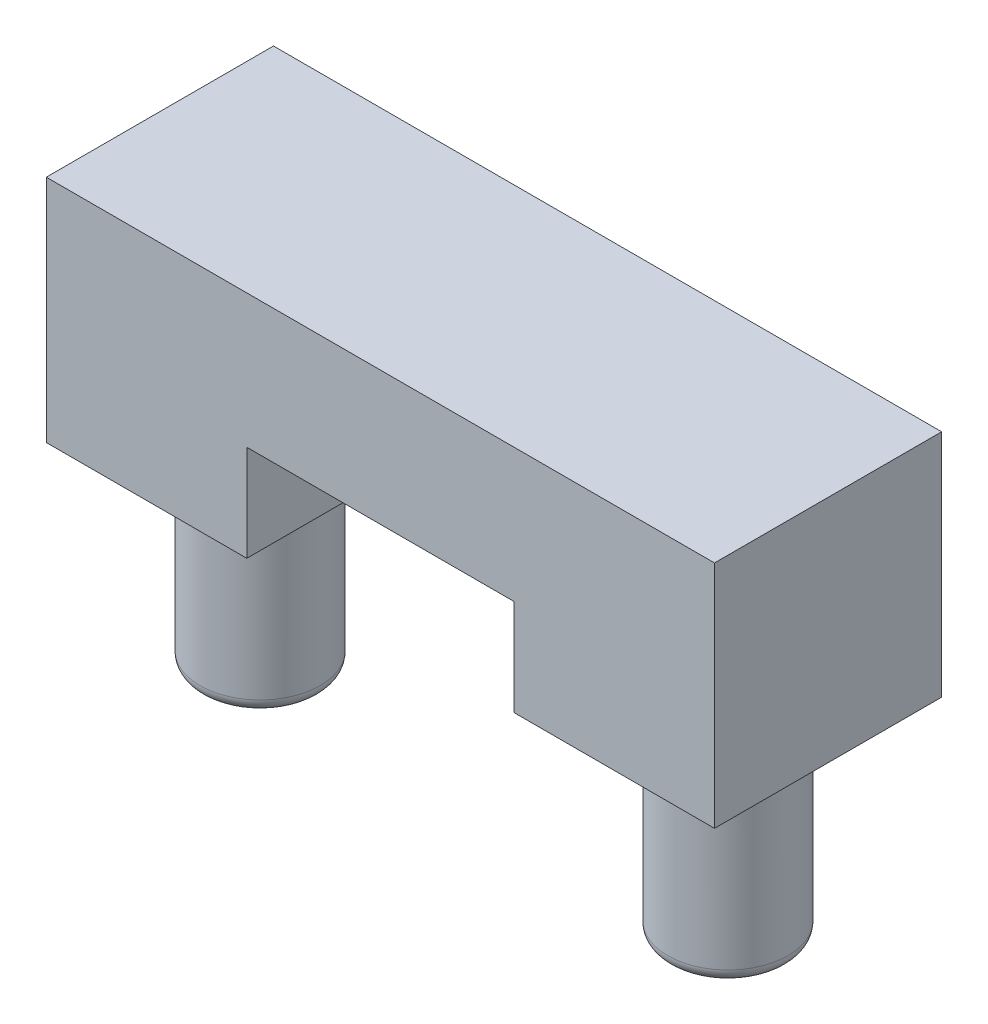
ISO-10303-21;
HEADER;
FILE_DESCRIPTION(('STEP AP214'),'2;1');
FILE_NAME('part.step','',(''),(''),'','','');
FILE_SCHEMA(('AUTOMOTIVE_DESIGN { 1 0 10303 214 1 1 1 1 }'));
ENDSEC;
DATA;
#1=APPLICATION_CONTEXT('core data for automotive mechanical design processes');
#2=APPLICATION_PROTOCOL_DEFINITION('international standard','automotive_design',2000,#1);
#3=PRODUCT_CONTEXT('',#1,'mechanical');
#4=PRODUCT('Part','Part','',(#3));
#5=PRODUCT_RELATED_PRODUCT_CATEGORY('part','',(#4));
#6=PRODUCT_DEFINITION_FORMATION('','',#4);
#7=PRODUCT_DEFINITION_CONTEXT('part definition',#1,'design');
#8=PRODUCT_DEFINITION('design','',#6,#7);
#9=PRODUCT_DEFINITION_SHAPE('','',#8);
#10=(LENGTH_UNIT() NAMED_UNIT(*) SI_UNIT(.MILLI.,.METRE.));
#11=(NAMED_UNIT(*) PLANE_ANGLE_UNIT() SI_UNIT($,.RADIAN.));
#12=(NAMED_UNIT(*) SI_UNIT($,.STERADIAN.) SOLID_ANGLE_UNIT());
#13=UNCERTAINTY_MEASURE_WITH_UNIT(LENGTH_MEASURE(1.E-05),#10,'distance_accuracy_value','');
#14=(GEOMETRIC_REPRESENTATION_CONTEXT(3) GLOBAL_UNCERTAINTY_ASSIGNED_CONTEXT((#13)) GLOBAL_UNIT_ASSIGNED_CONTEXT((#10,
#11,#12)) REPRESENTATION_CONTEXT('',''));
#15=CARTESIAN_POINT('',(0.,0.,0.));
#16=DIRECTION('',(0.,0.,1.));
#17=DIRECTION('',(1.,0.,0.));
#18=AXIS2_PLACEMENT_3D('',#15,#16,#17);
#19=CARTESIAN_POINT('',(0.,0.,0.));
#20=DIRECTION('',(0.,1.,0.));
#21=DIRECTION('',(0.,0.,1.));
#22=AXIS2_PLACEMENT_3D('',#19,#20,#21);
#23=PLANE('',#22);
#24=DIRECTION('',(0.,0.,-1.));
#25=VECTOR('',#24,1.);
#26=CARTESIAN_POINT('',(10.,0.,8.5));
#27=LINE('',#26,#25);
#28=CARTESIAN_POINT('',(10.,0.,8.5));
#29=VERTEX_POINT('',#28);
#30=CARTESIAN_POINT('',(10.,0.,-8.5));
#31=VERTEX_POINT('',#30);
#32=EDGE_CURVE('E111',#29,#31,#27,.T.);
#33=ORIENTED_EDGE('',*,*,#32,.F.);
#34=DIRECTION('',(1.,0.,0.));
#35=VECTOR('',#34,1.);
#36=CARTESIAN_POINT('',(-25.,0.,8.5));
#37=LINE('',#36,#35);
#38=CARTESIAN_POINT('',(-10.,0.,8.5));
#39=VERTEX_POINT('',#38);
#40=EDGE_CURVE('E129',#39,#29,#37,.T.);
#41=ORIENTED_EDGE('',*,*,#40,.F.);
#42=DIRECTION('',(0.,0.,1.));
#43=VECTOR('',#42,1.);
#44=CARTESIAN_POINT('',(-10.,0.,-8.5));
#45=LINE('',#44,#43);
#46=CARTESIAN_POINT('',(-10.,0.,-8.5));
#47=VERTEX_POINT('',#46);
#48=EDGE_CURVE('E120',#47,#39,#45,.T.);
#49=ORIENTED_EDGE('',*,*,#48,.F.);
#50=DIRECTION('',(-1.,0.,0.));
#51=VECTOR('',#50,1.);
#52=CARTESIAN_POINT('',(-25.,0.,-8.5));
#53=LINE('',#52,#51);
#54=EDGE_CURVE('E58',#31,#47,#53,.T.);
#55=ORIENTED_EDGE('',*,*,#54,.F.);
#56=EDGE_LOOP('',(#33,#41,#49,#55));
#57=FACE_BOUND('',#56,.T.);
#58=ADVANCED_FACE('F43',(#57),#23,.F.);
#59=CARTESIAN_POINT('',(25.,10.,-8.5));
#60=DIRECTION('',(-1.,0.,0.));
#61=DIRECTION('',(0.,0.,1.));
#62=AXIS2_PLACEMENT_3D('',#59,#60,#61);
#63=PLANE('',#62);
#64=DIRECTION('',(0.,-1.,0.));
#65=VECTOR('',#64,1.);
#66=CARTESIAN_POINT('',(25.,10.,8.5));
#67=LINE('',#66,#65);
#68=CARTESIAN_POINT('',(25.,10.,8.5));
#69=VERTEX_POINT('',#68);
#70=CARTESIAN_POINT('',(25.,-7.2,8.5));
#71=VERTEX_POINT('',#70);
#72=EDGE_CURVE('E139',#69,#71,#67,.T.);
#73=ORIENTED_EDGE('',*,*,#72,.T.);
#74=DIRECTION('',(0.,0.,1.));
#75=VECTOR('',#74,1.);
#76=CARTESIAN_POINT('',(25.,-7.2,8.5));
#77=LINE('',#76,#75);
#78=CARTESIAN_POINT('',(25.,-7.2,-8.5));
#79=VERTEX_POINT('',#78);
#80=EDGE_CURVE('E121',#79,#71,#77,.T.);
#81=ORIENTED_EDGE('',*,*,#80,.F.);
#82=DIRECTION('',(0.,-1.,0.));
#83=VECTOR('',#82,1.);
#84=CARTESIAN_POINT('',(25.,10.,-8.5));
#85=LINE('',#84,#83);
#86=CARTESIAN_POINT('',(25.,10.,-8.5));
#87=VERTEX_POINT('',#86);
#88=EDGE_CURVE('E145',#87,#79,#85,.T.);
#89=ORIENTED_EDGE('',*,*,#88,.F.);
#90=DIRECTION('',(0.,0.,-1.));
#91=VECTOR('',#90,1.);
#92=CARTESIAN_POINT('',(25.,10.,-8.5));
#93=LINE('',#92,#91);
#94=EDGE_CURVE('E132',#69,#87,#93,.T.);
#95=ORIENTED_EDGE('',*,*,#94,.F.);
#96=EDGE_LOOP('',(#73,#81,#89,#95));
#97=FACE_BOUND('',#96,.T.);
#98=ADVANCED_FACE('F173',(#97),#63,.F.);
#99=CARTESIAN_POINT('',(-25.,10.,-8.5));
#100=DIRECTION('',(0.,0.,1.));
#101=DIRECTION('',(1.,0.,0.));
#102=AXIS2_PLACEMENT_3D('',#99,#100,#101);
#103=PLANE('',#102);
#104=ORIENTED_EDGE('',*,*,#88,.T.);
#105=DIRECTION('',(1.,0.,0.));
#106=VECTOR('',#105,1.);
#107=CARTESIAN_POINT('',(25.,-7.2,-8.5));
#108=LINE('',#107,#106);
#109=CARTESIAN_POINT('',(10.,-7.2,-8.5));
#110=VERTEX_POINT('',#109);
#111=EDGE_CURVE('E125',#110,#79,#108,.T.);
#112=ORIENTED_EDGE('',*,*,#111,.F.);
#113=DIRECTION('',(0.,1.,0.));
#114=VECTOR('',#113,1.);
#115=CARTESIAN_POINT('',(10.,-7.2,-8.5));
#116=LINE('',#115,#114);
#117=EDGE_CURVE('E114',#110,#31,#116,.T.);
#118=ORIENTED_EDGE('',*,*,#117,.T.);
#119=ORIENTED_EDGE('',*,*,#54,.T.);
#120=DIRECTION('',(0.,1.,0.));
#121=VECTOR('',#120,1.);
#122=CARTESIAN_POINT('',(-10.,-7.2,-8.5));
#123=LINE('',#122,#121);
#124=CARTESIAN_POINT('',(-10.,-7.2,-8.5));
#125=VERTEX_POINT('',#124);
#126=EDGE_CURVE('E130',#125,#47,#123,.T.);
#127=ORIENTED_EDGE('',*,*,#126,.F.);
#128=DIRECTION('',(1.,0.,0.));
#129=VECTOR('',#128,1.);
#130=CARTESIAN_POINT('',(-25.,-7.2,-8.5));
#131=LINE('',#130,#129);
#132=CARTESIAN_POINT('',(-25.,-7.2,-8.5));
#133=VERTEX_POINT('',#132);
#134=EDGE_CURVE('E348',#133,#125,#131,.T.);
#135=ORIENTED_EDGE('',*,*,#134,.F.);
#136=DIRECTION('',(0.,-1.,0.));
#137=VECTOR('',#136,1.);
#138=CARTESIAN_POINT('',(-25.,10.,-8.5));
#139=LINE('',#138,#137);
#140=CARTESIAN_POINT('',(-25.,10.,-8.5));
#141=VERTEX_POINT('',#140);
#142=EDGE_CURVE('E143',#141,#133,#139,.T.);
#143=ORIENTED_EDGE('',*,*,#142,.F.);
#144=DIRECTION('',(-1.,0.,0.));
#145=VECTOR('',#144,1.);
#146=CARTESIAN_POINT('',(-25.,10.,-8.5));
#147=LINE('',#146,#145);
#148=EDGE_CURVE('E332',#87,#141,#147,.T.);
#149=ORIENTED_EDGE('',*,*,#148,.F.);
#150=EDGE_LOOP('',(#104,#112,#118,#119,#127,#135,#143,#149));
#151=FACE_BOUND('',#150,.T.);
#152=ADVANCED_FACE('F123',(#151),#103,.F.);
#153=CARTESIAN_POINT('',(-25.,10.,-8.5));
#154=DIRECTION('',(1.,0.,0.));
#155=DIRECTION('',(0.,0.,-1.));
#156=AXIS2_PLACEMENT_3D('',#153,#154,#155);
#157=PLANE('',#156);
#158=ORIENTED_EDGE('',*,*,#142,.T.);
#159=DIRECTION('',(0.,0.,-1.));
#160=VECTOR('',#159,1.);
#161=CARTESIAN_POINT('',(-25.,-7.2,-8.5));
#162=LINE('',#161,#160);
#163=CARTESIAN_POINT('',(-25.,-7.2,8.5));
#164=VERTEX_POINT('',#163);
#165=EDGE_CURVE('E345',#164,#133,#162,.T.);
#166=ORIENTED_EDGE('',*,*,#165,.F.);
#167=DIRECTION('',(0.,-1.,0.));
#168=VECTOR('',#167,1.);
#169=CARTESIAN_POINT('',(-25.,10.,8.5));
#170=LINE('',#169,#168);
#171=CARTESIAN_POINT('',(-25.,10.,8.5));
#172=VERTEX_POINT('',#171);
#173=EDGE_CURVE('E141',#172,#164,#170,.T.);
#174=ORIENTED_EDGE('',*,*,#173,.F.);
#175=DIRECTION('',(0.,0.,1.));
#176=VECTOR('',#175,1.);
#177=CARTESIAN_POINT('',(-25.,10.,-8.5));
#178=LINE('',#177,#176);
#179=EDGE_CURVE('E358',#141,#172,#178,.T.);
#180=ORIENTED_EDGE('',*,*,#179,.F.);
#181=EDGE_LOOP('',(#158,#166,#174,#180));
#182=FACE_BOUND('',#181,.T.);
#183=ADVANCED_FACE('F188',(#182),#157,.F.);
#184=CARTESIAN_POINT('',(-25.,10.,8.5));
#185=DIRECTION('',(0.,0.,-1.));
#186=DIRECTION('',(-1.,0.,0.));
#187=AXIS2_PLACEMENT_3D('',#184,#185,#186);
#188=PLANE('',#187);
#189=ORIENTED_EDGE('',*,*,#173,.T.);
#190=DIRECTION('',(-1.,0.,0.));
#191=VECTOR('',#190,1.);
#192=CARTESIAN_POINT('',(-25.,-7.2,8.5));
#193=LINE('',#192,#191);
#194=CARTESIAN_POINT('',(-10.,-7.2,8.5));
#195=VERTEX_POINT('',#194);
#196=EDGE_CURVE('E352',#195,#164,#193,.T.);
#197=ORIENTED_EDGE('',*,*,#196,.F.);
#198=DIRECTION('',(0.,1.,0.));
#199=VECTOR('',#198,1.);
#200=CARTESIAN_POINT('',(-10.,-7.2,8.5));
#201=LINE('',#200,#199);
#202=EDGE_CURVE('E134',#195,#39,#201,.T.);
#203=ORIENTED_EDGE('',*,*,#202,.T.);
#204=ORIENTED_EDGE('',*,*,#40,.T.);
#205=DIRECTION('',(0.,1.,0.));
#206=VECTOR('',#205,1.);
#207=CARTESIAN_POINT('',(10.,-7.2,8.5));
#208=LINE('',#207,#206);
#209=CARTESIAN_POINT('',(10.,-7.2,8.5));
#210=VERTEX_POINT('',#209);
#211=EDGE_CURVE('E117',#210,#29,#208,.T.);
#212=ORIENTED_EDGE('',*,*,#211,.F.);
#213=DIRECTION('',(-1.,0.,0.));
#214=VECTOR('',#213,1.);
#215=CARTESIAN_POINT('',(25.,-7.2,8.5));
#216=LINE('',#215,#214);
#217=EDGE_CURVE('E340',#71,#210,#216,.T.);
#218=ORIENTED_EDGE('',*,*,#217,.F.);
#219=ORIENTED_EDGE('',*,*,#72,.F.);
#220=DIRECTION('',(1.,0.,0.));
#221=VECTOR('',#220,1.);
#222=CARTESIAN_POINT('',(-25.,10.,8.5));
#223=LINE('',#222,#221);
#224=EDGE_CURVE('E66',#172,#69,#223,.T.);
#225=ORIENTED_EDGE('',*,*,#224,.F.);
#226=EDGE_LOOP('',(#189,#197,#203,#204,#212,#218,#219,#225));
#227=FACE_BOUND('',#226,.T.);
#228=ADVANCED_FACE('F185',(#227),#188,.F.);
#229=CARTESIAN_POINT('',(0.,10.,0.));
#230=DIRECTION('',(0.,1.,0.));
#231=DIRECTION('',(0.,0.,1.));
#232=AXIS2_PLACEMENT_3D('',#229,#230,#231);
#233=PLANE('',#232);
#234=ORIENTED_EDGE('',*,*,#94,.T.);
#235=ORIENTED_EDGE('',*,*,#148,.T.);
#236=ORIENTED_EDGE('',*,*,#179,.T.);
#237=ORIENTED_EDGE('',*,*,#224,.T.);
#238=EDGE_LOOP('',(#234,#235,#236,#237));
#239=FACE_BOUND('',#238,.T.);
#240=ADVANCED_FACE('F183',(#239),#233,.T.);
#241=CARTESIAN_POINT('',(-10.,-7.2,-8.5));
#242=DIRECTION('',(-1.,0.,0.));
#243=DIRECTION('',(0.,0.,1.));
#244=AXIS2_PLACEMENT_3D('',#241,#242,#243);
#245=PLANE('',#244);
#246=ORIENTED_EDGE('',*,*,#48,.T.);
#247=ORIENTED_EDGE('',*,*,#202,.F.);
#248=DIRECTION('',(0.,0.,1.));
#249=VECTOR('',#248,1.);
#250=CARTESIAN_POINT('',(-10.,-7.2,-8.5));
#251=LINE('',#250,#249);
#252=EDGE_CURVE('E350',#125,#195,#251,.T.);
#253=ORIENTED_EDGE('',*,*,#252,.F.);
#254=ORIENTED_EDGE('',*,*,#126,.T.);
#255=EDGE_LOOP('',(#246,#247,#253,#254));
#256=FACE_BOUND('',#255,.T.);
#257=ADVANCED_FACE('F213',(#256),#245,.F.);
#258=CARTESIAN_POINT('',(0.,-7.2,0.));
#259=DIRECTION('',(0.,1.,0.));
#260=DIRECTION('',(0.,0.,1.));
#261=AXIS2_PLACEMENT_3D('',#258,#259,#260);
#262=PLANE('',#261);
#263=CARTESIAN_POINT('',(-17.5,-7.2,0.));
#264=DIRECTION('',(0.,1.,0.));
#265=DIRECTION('',(0.,0.,1.));
#266=AXIS2_PLACEMENT_3D('',#263,#264,#265);
#267=CIRCLE('',#266,4.5);
#268=CARTESIAN_POINT('',(-17.5,-7.2,4.5));
#269=VERTEX_POINT('',#268);
#270=EDGE_CURVE('E147',#269,#269,#267,.F.);
#271=ORIENTED_EDGE('',*,*,#270,.F.);
#272=EDGE_LOOP('',(#271));
#273=FACE_BOUND('',#272,.T.);
#274=ORIENTED_EDGE('',*,*,#165,.T.);
#275=ORIENTED_EDGE('',*,*,#134,.T.);
#276=ORIENTED_EDGE('',*,*,#252,.T.);
#277=ORIENTED_EDGE('',*,*,#196,.T.);
#278=EDGE_LOOP('',(#274,#275,#276,#277));
#279=FACE_BOUND('',#278,.T.);
#280=ADVANCED_FACE('F216',(#273,#279),#262,.F.);
#281=CARTESIAN_POINT('',(10.,-7.2,8.5));
#282=DIRECTION('',(1.,0.,0.));
#283=DIRECTION('',(0.,0.,-1.));
#284=AXIS2_PLACEMENT_3D('',#281,#282,#283);
#285=PLANE('',#284);
#286=ORIENTED_EDGE('',*,*,#32,.T.);
#287=ORIENTED_EDGE('',*,*,#117,.F.);
#288=DIRECTION('',(0.,0.,-1.));
#289=VECTOR('',#288,1.);
#290=CARTESIAN_POINT('',(10.,-7.2,8.5));
#291=LINE('',#290,#289);
#292=EDGE_CURVE('E338',#210,#110,#291,.T.);
#293=ORIENTED_EDGE('',*,*,#292,.F.);
#294=ORIENTED_EDGE('',*,*,#211,.T.);
#295=EDGE_LOOP('',(#286,#287,#293,#294));
#296=FACE_BOUND('',#295,.T.);
#297=ADVANCED_FACE('F112',(#296),#285,.F.);
#298=CARTESIAN_POINT('',(0.,-7.2,0.));
#299=DIRECTION('',(0.,1.,0.));
#300=DIRECTION('',(0.,0.,1.));
#301=AXIS2_PLACEMENT_3D('',#298,#299,#300);
#302=PLANE('',#301);
#303=CARTESIAN_POINT('',(17.5,-7.2,0.));
#304=DIRECTION('',(0.,1.,0.));
#305=DIRECTION('',(0.,0.,1.));
#306=AXIS2_PLACEMENT_3D('',#303,#304,#305);
#307=CIRCLE('',#306,4.5);
#308=CARTESIAN_POINT('',(17.5,-7.2,4.5));
#309=VERTEX_POINT('',#308);
#310=EDGE_CURVE('E150',#309,#309,#307,.F.);
#311=ORIENTED_EDGE('',*,*,#310,.F.);
#312=EDGE_LOOP('',(#311));
#313=FACE_BOUND('',#312,.T.);
#314=ORIENTED_EDGE('',*,*,#80,.T.);
#315=ORIENTED_EDGE('',*,*,#217,.T.);
#316=ORIENTED_EDGE('',*,*,#292,.T.);
#317=ORIENTED_EDGE('',*,*,#111,.T.);
#318=EDGE_LOOP('',(#314,#315,#316,#317));
#319=FACE_BOUND('',#318,.T.);
#320=ADVANCED_FACE('F225',(#313,#319),#302,.F.);
#321=CARTESIAN_POINT('',(-17.5,-22.2,0.));
#322=DIRECTION('',(0.,1.,0.));
#323=DIRECTION('',(0.,0.,1.));
#324=AXIS2_PLACEMENT_3D('',#321,#322,#323);
#325=CYLINDRICAL_SURFACE('',#324,4.5);
#326=CARTESIAN_POINT('',(-17.5,-21.2,0.));
#327=DIRECTION('',(0.,-1.,0.));
#328=DIRECTION('',(0.,0.,-1.));
#329=AXIS2_PLACEMENT_3D('',#326,#327,#328);
#330=CIRCLE('',#329,4.5);
#331=CARTESIAN_POINT('',(-17.5,-21.2,-4.5));
#332=VERTEX_POINT('',#331);
#333=EDGE_CURVE('E11',#332,#332,#330,.F.);
#334=ORIENTED_EDGE('',*,*,#333,.T.);
#335=EDGE_LOOP('',(#334));
#336=FACE_BOUND('',#335,.T.);
#337=ORIENTED_EDGE('',*,*,#270,.T.);
#338=EDGE_LOOP('',(#337));
#339=FACE_BOUND('',#338,.T.);
#340=ADVANCED_FACE('F240',(#336,#339),#325,.T.);
#341=CARTESIAN_POINT('',(-17.5,-22.2,0.));
#342=DIRECTION('',(0.,-1.,0.));
#343=DIRECTION('',(0.,0.,-1.));
#344=AXIS2_PLACEMENT_3D('',#341,#342,#343);
#345=PLANE('',#344);
#346=CARTESIAN_POINT('',(-17.5,-22.2,0.));
#347=DIRECTION('',(0.,-1.,0.));
#348=DIRECTION('',(0.,0.,-1.));
#349=AXIS2_PLACEMENT_3D('',#346,#347,#348);
#350=CIRCLE('',#349,3.5);
#351=CARTESIAN_POINT('',(-17.5,-22.2,-3.5));
#352=VERTEX_POINT('',#351);
#353=EDGE_CURVE('E51',#352,#352,#350,.T.);
#354=ORIENTED_EDGE('',*,*,#353,.T.);
#355=EDGE_LOOP('',(#354));
#356=FACE_BOUND('',#355,.T.);
#357=ADVANCED_FACE('F161',(#356),#345,.T.);
#358=CARTESIAN_POINT('',(17.5,-22.2,0.));
#359=DIRECTION('',(0.,1.,0.));
#360=DIRECTION('',(0.,0.,1.));
#361=AXIS2_PLACEMENT_3D('',#358,#359,#360);
#362=CYLINDRICAL_SURFACE('',#361,4.5);
#363=CARTESIAN_POINT('',(17.5,-21.2,0.));
#364=DIRECTION('',(0.,-1.,0.));
#365=DIRECTION('',(0.,0.,-1.));
#366=AXIS2_PLACEMENT_3D('',#363,#364,#365);
#367=CIRCLE('',#366,4.5);
#368=CARTESIAN_POINT('',(17.5,-21.2,-4.5));
#369=VERTEX_POINT('',#368);
#370=EDGE_CURVE('E156',#369,#369,#367,.F.);
#371=ORIENTED_EDGE('',*,*,#370,.T.);
#372=EDGE_LOOP('',(#371));
#373=FACE_BOUND('',#372,.T.);
#374=ORIENTED_EDGE('',*,*,#310,.T.);
#375=EDGE_LOOP('',(#374));
#376=FACE_BOUND('',#375,.T.);
#377=ADVANCED_FACE('F257',(#373,#376),#362,.T.);
#378=CARTESIAN_POINT('',(17.5,-22.2,0.));
#379=DIRECTION('',(0.,-1.,0.));
#380=DIRECTION('',(0.,0.,-1.));
#381=AXIS2_PLACEMENT_3D('',#378,#379,#380);
#382=PLANE('',#381);
#383=CARTESIAN_POINT('',(17.5,-22.2,0.));
#384=DIRECTION('',(0.,-1.,0.));
#385=DIRECTION('',(0.,0.,-1.));
#386=AXIS2_PLACEMENT_3D('',#383,#384,#385);
#387=CIRCLE('',#386,3.5);
#388=CARTESIAN_POINT('',(17.5,-22.2,-3.5));
#389=VERTEX_POINT('',#388);
#390=EDGE_CURVE('E153',#389,#389,#387,.T.);
#391=ORIENTED_EDGE('',*,*,#390,.T.);
#392=EDGE_LOOP('',(#391));
#393=FACE_BOUND('',#392,.T.);
#394=ADVANCED_FACE('F169',(#393),#382,.T.);
#395=CARTESIAN_POINT('',(17.5,-21.2,0.));
#396=DIRECTION('',(0.,-1.,0.));
#397=DIRECTION('',(0.,0.,-1.));
#398=AXIS2_PLACEMENT_3D('',#395,#396,#397);
#399=TOROIDAL_SURFACE('',#398,3.5,1.);
#400=ORIENTED_EDGE('',*,*,#370,.F.);
#401=EDGE_LOOP('',(#400));
#402=FACE_BOUND('',#401,.T.);
#403=ORIENTED_EDGE('',*,*,#390,.F.);
#404=EDGE_LOOP('',(#403));
#405=FACE_BOUND('',#404,.T.);
#406=ADVANCED_FACE('F164',(#402,#405),#399,.T.);
#407=CARTESIAN_POINT('',(-17.5,-21.2,0.));
#408=DIRECTION('',(0.,-1.,0.));
#409=DIRECTION('',(0.,0.,-1.));
#410=AXIS2_PLACEMENT_3D('',#407,#408,#409);
#411=TOROIDAL_SURFACE('',#410,3.5,1.);
#412=ORIENTED_EDGE('',*,*,#333,.F.);
#413=EDGE_LOOP('',(#412));
#414=FACE_BOUND('',#413,.T.);
#415=ORIENTED_EDGE('',*,*,#353,.F.);
#416=EDGE_LOOP('',(#415));
#417=FACE_BOUND('',#416,.T.);
#418=ADVANCED_FACE('F45',(#414,#417),#411,.T.);
#419=CLOSED_SHELL('',(#58,#98,#152,#183,#228,#240,#257,#280,#297,#320,#340,#357,#377,#394,#406,#418));
#420=MANIFOLD_SOLID_BREP('B2',#419);
#421=ADVANCED_BREP_SHAPE_REPRESENTATION('',(#18,#420),#14);
#422=SHAPE_DEFINITION_REPRESENTATION(#9,#421);
ENDSEC;
END-ISO-10303-21;
